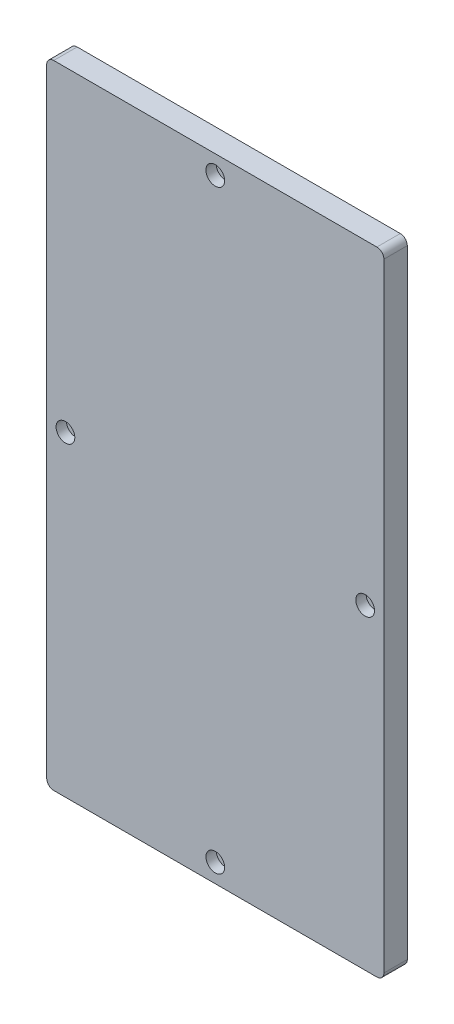
ISO-10303-21;
HEADER;
FILE_DESCRIPTION(('STEP AP214'),'2;1');
FILE_NAME('part.step','',(''),(''),'','','');
FILE_SCHEMA(('AUTOMOTIVE_DESIGN { 1 0 10303 214 1 1 1 1 }'));
ENDSEC;
DATA;
#1=APPLICATION_CONTEXT('core data for automotive mechanical design processes');
#2=APPLICATION_PROTOCOL_DEFINITION('international standard','automotive_design',2000,#1);
#3=PRODUCT_CONTEXT('',#1,'mechanical');
#4=PRODUCT('Part','Part','',(#3));
#5=PRODUCT_RELATED_PRODUCT_CATEGORY('part','',(#4));
#6=PRODUCT_DEFINITION_FORMATION('','',#4);
#7=PRODUCT_DEFINITION_CONTEXT('part definition',#1,'design');
#8=PRODUCT_DEFINITION('design','',#6,#7);
#9=PRODUCT_DEFINITION_SHAPE('','',#8);
#10=(LENGTH_UNIT() NAMED_UNIT(*) SI_UNIT(.MILLI.,.METRE.));
#11=(NAMED_UNIT(*) PLANE_ANGLE_UNIT() SI_UNIT($,.RADIAN.));
#12=(NAMED_UNIT(*) SI_UNIT($,.STERADIAN.) SOLID_ANGLE_UNIT());
#13=UNCERTAINTY_MEASURE_WITH_UNIT(LENGTH_MEASURE(1.E-05),#10,'distance_accuracy_value','');
#14=(GEOMETRIC_REPRESENTATION_CONTEXT(3) GLOBAL_UNCERTAINTY_ASSIGNED_CONTEXT((#13)) GLOBAL_UNIT_ASSIGNED_CONTEXT((#10,
#11,#12)) REPRESENTATION_CONTEXT('',''));
#15=CARTESIAN_POINT('',(0.,0.,0.));
#16=DIRECTION('',(0.,0.,1.));
#17=DIRECTION('',(1.,0.,0.));
#18=AXIS2_PLACEMENT_3D('',#15,#16,#17);
#19=CARTESIAN_POINT('',(0.,0.,0.));
#20=DIRECTION('',(0.,0.,1.));
#21=DIRECTION('',(1.,0.,0.));
#22=AXIS2_PLACEMENT_3D('',#19,#20,#21);
#23=PLANE('',#22);
#24=CARTESIAN_POINT('',(0.,127.,0.));
#25=DIRECTION('',(0.,0.,1.));
#26=DIRECTION('',(1.,0.,0.));
#27=AXIS2_PLACEMENT_3D('',#24,#25,#26);
#28=CIRCLE('',#27,2.275);
#29=CARTESIAN_POINT('',(2.275,127.,0.));
#30=VERTEX_POINT('',#29);
#31=EDGE_CURVE('E197',#30,#30,#28,.T.);
#32=ORIENTED_EDGE('',*,*,#31,.T.);
#33=EDGE_LOOP('',(#32));
#34=FACE_BOUND('',#33,.T.);
#35=CARTESIAN_POINT('',(-64.,0.,0.));
#36=DIRECTION('',(0.,0.,1.));
#37=DIRECTION('',(1.,0.,0.));
#38=AXIS2_PLACEMENT_3D('',#35,#36,#37);
#39=CIRCLE('',#38,2.275);
#40=CARTESIAN_POINT('',(-61.725,0.,0.));
#41=VERTEX_POINT('',#40);
#42=EDGE_CURVE('E266',#41,#41,#39,.T.);
#43=ORIENTED_EDGE('',*,*,#42,.T.);
#44=EDGE_LOOP('',(#43));
#45=FACE_BOUND('',#44,.T.);
#46=CARTESIAN_POINT('',(0.,-127.,0.));
#47=DIRECTION('',(0.,0.,1.));
#48=DIRECTION('',(1.,0.,0.));
#49=AXIS2_PLACEMENT_3D('',#46,#47,#48);
#50=CIRCLE('',#49,2.275);
#51=CARTESIAN_POINT('',(2.275,-127.,0.));
#52=VERTEX_POINT('',#51);
#53=EDGE_CURVE('E281',#52,#52,#50,.T.);
#54=ORIENTED_EDGE('',*,*,#53,.T.);
#55=EDGE_LOOP('',(#54));
#56=FACE_BOUND('',#55,.T.);
#57=CARTESIAN_POINT('',(64.,0.,0.));
#58=DIRECTION('',(0.,0.,1.));
#59=DIRECTION('',(1.,0.,0.));
#60=AXIS2_PLACEMENT_3D('',#57,#58,#59);
#61=CIRCLE('',#60,2.275);
#62=CARTESIAN_POINT('',(66.275,0.,0.));
#63=VERTEX_POINT('',#62);
#64=EDGE_CURVE('E296',#63,#63,#61,.T.);
#65=ORIENTED_EDGE('',*,*,#64,.T.);
#66=EDGE_LOOP('',(#65));
#67=FACE_BOUND('',#66,.T.);
#68=DIRECTION('',(0.,-1.,0.));
#69=VECTOR('',#68,1.);
#70=CARTESIAN_POINT('',(-72.,-135.,0.));
#71=LINE('',#70,#69);
#72=CARTESIAN_POINT('',(-72.,132.,0.));
#73=VERTEX_POINT('',#72);
#74=CARTESIAN_POINT('',(-72.,-132.,0.));
#75=VERTEX_POINT('',#74);
#76=EDGE_CURVE('E311',#73,#75,#71,.T.);
#77=ORIENTED_EDGE('',*,*,#76,.F.);
#78=CARTESIAN_POINT('',(-69.,132.,0.));
#79=DIRECTION('',(0.,0.,1.));
#80=DIRECTION('',(1.,0.,0.));
#81=AXIS2_PLACEMENT_3D('',#78,#79,#80);
#82=CIRCLE('',#81,3.);
#83=CARTESIAN_POINT('',(-69.,135.,0.));
#84=VERTEX_POINT('',#83);
#85=EDGE_CURVE('E343',#73,#84,#82,.F.);
#86=ORIENTED_EDGE('',*,*,#85,.T.);
#87=DIRECTION('',(-1.,0.,0.));
#88=VECTOR('',#87,1.);
#89=CARTESIAN_POINT('',(72.,135.,0.));
#90=LINE('',#89,#88);
#91=CARTESIAN_POINT('',(69.,135.,0.));
#92=VERTEX_POINT('',#91);
#93=EDGE_CURVE('E316',#92,#84,#90,.T.);
#94=ORIENTED_EDGE('',*,*,#93,.F.);
#95=CARTESIAN_POINT('',(69.,132.,0.));
#96=DIRECTION('',(0.,0.,1.));
#97=DIRECTION('',(1.,0.,0.));
#98=AXIS2_PLACEMENT_3D('',#95,#96,#97);
#99=CIRCLE('',#98,3.);
#100=CARTESIAN_POINT('',(72.,132.,0.));
#101=VERTEX_POINT('',#100);
#102=EDGE_CURVE('E337',#92,#101,#99,.F.);
#103=ORIENTED_EDGE('',*,*,#102,.T.);
#104=DIRECTION('',(0.,1.,0.));
#105=VECTOR('',#104,1.);
#106=CARTESIAN_POINT('',(72.,-135.,0.));
#107=LINE('',#106,#105);
#108=CARTESIAN_POINT('',(72.,-132.,0.));
#109=VERTEX_POINT('',#108);
#110=EDGE_CURVE('E329',#109,#101,#107,.T.);
#111=ORIENTED_EDGE('',*,*,#110,.F.);
#112=CARTESIAN_POINT('',(69.,-132.,0.));
#113=DIRECTION('',(0.,0.,1.));
#114=DIRECTION('',(1.,0.,0.));
#115=AXIS2_PLACEMENT_3D('',#112,#113,#114);
#116=CIRCLE('',#115,3.);
#117=CARTESIAN_POINT('',(69.,-135.,0.));
#118=VERTEX_POINT('',#117);
#119=EDGE_CURVE('E339',#109,#118,#116,.F.);
#120=ORIENTED_EDGE('',*,*,#119,.T.);
#121=DIRECTION('',(1.,0.,0.));
#122=VECTOR('',#121,1.);
#123=CARTESIAN_POINT('',(72.,-135.,0.));
#124=LINE('',#123,#122);
#125=CARTESIAN_POINT('',(-69.,-135.,0.));
#126=VERTEX_POINT('',#125);
#127=EDGE_CURVE('E326',#126,#118,#124,.T.);
#128=ORIENTED_EDGE('',*,*,#127,.F.);
#129=CARTESIAN_POINT('',(-69.,-132.,0.));
#130=DIRECTION('',(0.,0.,1.));
#131=DIRECTION('',(1.,0.,0.));
#132=AXIS2_PLACEMENT_3D('',#129,#130,#131);
#133=CIRCLE('',#132,3.);
#134=EDGE_CURVE('E341',#126,#75,#133,.F.);
#135=ORIENTED_EDGE('',*,*,#134,.T.);
#136=EDGE_LOOP('',(#77,#86,#94,#103,#111,#120,#128,#135));
#137=FACE_BOUND('',#136,.T.);
#138=DIRECTION('',(-1.,0.,0.));
#139=VECTOR('',#138,1.);
#140=CARTESIAN_POINT('',(0.,-130.,0.));
#141=LINE('',#140,#139);
#142=CARTESIAN_POINT('',(67.,-130.,0.));
#143=VERTEX_POINT('',#142);
#144=CARTESIAN_POINT('',(6.32455532033673,-130.,0.));
#145=VERTEX_POINT('',#144);
#146=EDGE_CURVE('E202',#143,#145,#141,.T.);
#147=ORIENTED_EDGE('',*,*,#146,.F.);
#148=DIRECTION('',(0.,-1.,0.));
#149=VECTOR('',#148,1.);
#150=CARTESIAN_POINT('',(67.,0.,0.));
#151=LINE('',#150,#149);
#152=CARTESIAN_POINT('',(67.,-6.32455532033675,0.));
#153=VERTEX_POINT('',#152);
#154=EDGE_CURVE('E181',#153,#143,#151,.T.);
#155=ORIENTED_EDGE('',*,*,#154,.F.);
#156=CARTESIAN_POINT('',(64.,0.,0.));
#157=DIRECTION('',(0.,0.,1.));
#158=DIRECTION('',(1.,0.,0.));
#159=AXIS2_PLACEMENT_3D('',#156,#157,#158);
#160=CIRCLE('',#159,7.);
#161=CARTESIAN_POINT('',(67.,6.32455532033675,0.));
#162=VERTEX_POINT('',#161);
#163=EDGE_CURVE('E193',#162,#153,#160,.T.);
#164=ORIENTED_EDGE('',*,*,#163,.F.);
#165=DIRECTION('',(0.,-1.,0.));
#166=VECTOR('',#165,1.);
#167=CARTESIAN_POINT('',(67.,0.,0.));
#168=LINE('',#167,#166);
#169=CARTESIAN_POINT('',(67.,130.,0.));
#170=VERTEX_POINT('',#169);
#171=EDGE_CURVE('E875',#170,#162,#168,.T.);
#172=ORIENTED_EDGE('',*,*,#171,.F.);
#173=DIRECTION('',(1.,0.,0.));
#174=VECTOR('',#173,1.);
#175=CARTESIAN_POINT('',(0.,130.,0.));
#176=LINE('',#175,#174);
#177=CARTESIAN_POINT('',(6.32455532033675,130.,0.));
#178=VERTEX_POINT('',#177);
#179=EDGE_CURVE('E874',#178,#170,#176,.T.);
#180=ORIENTED_EDGE('',*,*,#179,.F.);
#181=CARTESIAN_POINT('',(0.,127.,0.));
#182=DIRECTION('',(0.,0.,1.));
#183=DIRECTION('',(1.,0.,0.));
#184=AXIS2_PLACEMENT_3D('',#181,#182,#183);
#185=CIRCLE('',#184,7.00000000000001);
#186=CARTESIAN_POINT('',(-6.32455532033675,130.,0.));
#187=VERTEX_POINT('',#186);
#188=EDGE_CURVE('E877',#178,#187,#185,.F.);
#189=ORIENTED_EDGE('',*,*,#188,.T.);
#190=DIRECTION('',(1.,0.,0.));
#191=VECTOR('',#190,1.);
#192=CARTESIAN_POINT('',(0.,130.,0.));
#193=LINE('',#192,#191);
#194=CARTESIAN_POINT('',(-67.,130.,0.));
#195=VERTEX_POINT('',#194);
#196=EDGE_CURVE('E866',#195,#187,#193,.T.);
#197=ORIENTED_EDGE('',*,*,#196,.F.);
#198=DIRECTION('',(0.,1.,0.));
#199=VECTOR('',#198,1.);
#200=CARTESIAN_POINT('',(-67.,0.,0.));
#201=LINE('',#200,#199);
#202=CARTESIAN_POINT('',(-67.,6.32455532033677,0.));
#203=VERTEX_POINT('',#202);
#204=EDGE_CURVE('E863',#203,#195,#201,.T.);
#205=ORIENTED_EDGE('',*,*,#204,.F.);
#206=CARTESIAN_POINT('',(-64.,0.,0.));
#207=DIRECTION('',(0.,0.,1.));
#208=DIRECTION('',(1.,0.,0.));
#209=AXIS2_PLACEMENT_3D('',#206,#207,#208);
#210=CIRCLE('',#209,7.);
#211=CARTESIAN_POINT('',(-67.,-6.32455532033677,0.));
#212=VERTEX_POINT('',#211);
#213=EDGE_CURVE('E883',#203,#212,#210,.F.);
#214=ORIENTED_EDGE('',*,*,#213,.T.);
#215=DIRECTION('',(0.,1.,0.));
#216=VECTOR('',#215,1.);
#217=CARTESIAN_POINT('',(-67.,0.,0.));
#218=LINE('',#217,#216);
#219=CARTESIAN_POINT('',(-67.,-130.,0.));
#220=VERTEX_POINT('',#219);
#221=EDGE_CURVE('E854',#220,#212,#218,.T.);
#222=ORIENTED_EDGE('',*,*,#221,.F.);
#223=DIRECTION('',(-1.,0.,0.));
#224=VECTOR('',#223,1.);
#225=CARTESIAN_POINT('',(0.,-130.,0.));
#226=LINE('',#225,#224);
#227=CARTESIAN_POINT('',(-6.32455532033673,-130.,0.));
#228=VERTEX_POINT('',#227);
#229=EDGE_CURVE('E851',#228,#220,#226,.T.);
#230=ORIENTED_EDGE('',*,*,#229,.F.);
#231=CARTESIAN_POINT('',(0.,-127.,0.));
#232=DIRECTION('',(0.,0.,1.));
#233=DIRECTION('',(1.,0.,0.));
#234=AXIS2_PLACEMENT_3D('',#231,#232,#233);
#235=CIRCLE('',#234,7.);
#236=EDGE_CURVE('E207',#145,#228,#235,.T.);
#237=ORIENTED_EDGE('',*,*,#236,.F.);
#238=EDGE_LOOP('',(#147,#155,#164,#172,#180,#189,#197,#205,#214,#222,#230,#237));
#239=FACE_BOUND('',#238,.T.);
#240=ADVANCED_FACE('F39',(#34,#45,#56,#67,#137,#239),#23,.F.);
#241=CARTESIAN_POINT('',(-72.,-135.,10.));
#242=DIRECTION('',(1.,0.,0.));
#243=DIRECTION('',(0.,0.,-1.));
#244=AXIS2_PLACEMENT_3D('',#241,#242,#243);
#245=PLANE('',#244);
#246=DIRECTION('',(0.,-1.,0.));
#247=VECTOR('',#246,1.);
#248=CARTESIAN_POINT('',(-72.,-135.,10.));
#249=LINE('',#248,#247);
#250=CARTESIAN_POINT('',(-72.,132.,10.));
#251=VERTEX_POINT('',#250);
#252=CARTESIAN_POINT('',(-72.,-132.,10.));
#253=VERTEX_POINT('',#252);
#254=EDGE_CURVE('E312',#251,#253,#249,.T.);
#255=ORIENTED_EDGE('',*,*,#254,.F.);
#256=DIRECTION('',(0.,0.,-1.));
#257=VECTOR('',#256,1.);
#258=CARTESIAN_POINT('',(-72.,132.,10.));
#259=LINE('',#258,#257);
#260=EDGE_CURVE('E334',#251,#73,#259,.T.);
#261=ORIENTED_EDGE('',*,*,#260,.T.);
#262=ORIENTED_EDGE('',*,*,#76,.T.);
#263=DIRECTION('',(0.,0.,-1.));
#264=VECTOR('',#263,1.);
#265=CARTESIAN_POINT('',(-72.,-132.,10.));
#266=LINE('',#265,#264);
#267=EDGE_CURVE('E323',#75,#253,#266,.F.);
#268=ORIENTED_EDGE('',*,*,#267,.T.);
#269=EDGE_LOOP('',(#255,#261,#262,#268));
#270=FACE_BOUND('',#269,.T.);
#271=ADVANCED_FACE('F391',(#270),#245,.F.);
#272=CARTESIAN_POINT('',(72.,-135.,10.));
#273=DIRECTION('',(0.,1.,0.));
#274=DIRECTION('',(-1.,0.,0.));
#275=AXIS2_PLACEMENT_3D('',#272,#273,#274);
#276=PLANE('',#275);
#277=DIRECTION('',(1.,0.,0.));
#278=VECTOR('',#277,1.);
#279=CARTESIAN_POINT('',(72.,-135.,10.));
#280=LINE('',#279,#278);
#281=CARTESIAN_POINT('',(-69.,-135.,10.));
#282=VERTEX_POINT('',#281);
#283=CARTESIAN_POINT('',(69.,-135.,10.));
#284=VERTEX_POINT('',#283);
#285=EDGE_CURVE('E315',#282,#284,#280,.T.);
#286=ORIENTED_EDGE('',*,*,#285,.F.);
#287=DIRECTION('',(0.,0.,-1.));
#288=VECTOR('',#287,1.);
#289=CARTESIAN_POINT('',(-69.,-135.,10.));
#290=LINE('',#289,#288);
#291=EDGE_CURVE('E359',#282,#126,#290,.T.);
#292=ORIENTED_EDGE('',*,*,#291,.T.);
#293=ORIENTED_EDGE('',*,*,#127,.T.);
#294=DIRECTION('',(0.,0.,-1.));
#295=VECTOR('',#294,1.);
#296=CARTESIAN_POINT('',(69.,-135.,10.));
#297=LINE('',#296,#295);
#298=EDGE_CURVE('E357',#118,#284,#297,.F.);
#299=ORIENTED_EDGE('',*,*,#298,.T.);
#300=EDGE_LOOP('',(#286,#292,#293,#299));
#301=FACE_BOUND('',#300,.T.);
#302=ADVANCED_FACE('F365',(#301),#276,.F.);
#303=CARTESIAN_POINT('',(72.,-135.,10.));
#304=DIRECTION('',(-1.,0.,0.));
#305=DIRECTION('',(0.,0.,1.));
#306=AXIS2_PLACEMENT_3D('',#303,#304,#305);
#307=PLANE('',#306);
#308=DIRECTION('',(0.,1.,0.));
#309=VECTOR('',#308,1.);
#310=CARTESIAN_POINT('',(72.,-135.,10.));
#311=LINE('',#310,#309);
#312=CARTESIAN_POINT('',(72.,-132.,10.));
#313=VERTEX_POINT('',#312);
#314=CARTESIAN_POINT('',(72.,132.,10.));
#315=VERTEX_POINT('',#314);
#316=EDGE_CURVE('E318',#313,#315,#311,.T.);
#317=ORIENTED_EDGE('',*,*,#316,.F.);
#318=DIRECTION('',(0.,0.,-1.));
#319=VECTOR('',#318,1.);
#320=CARTESIAN_POINT('',(72.,-132.,10.));
#321=LINE('',#320,#319);
#322=EDGE_CURVE('E11',#313,#109,#321,.T.);
#323=ORIENTED_EDGE('',*,*,#322,.T.);
#324=ORIENTED_EDGE('',*,*,#110,.T.);
#325=DIRECTION('',(0.,0.,-1.));
#326=VECTOR('',#325,1.);
#327=CARTESIAN_POINT('',(72.,132.,10.));
#328=LINE('',#327,#326);
#329=EDGE_CURVE('E47',#101,#315,#328,.F.);
#330=ORIENTED_EDGE('',*,*,#329,.T.);
#331=EDGE_LOOP('',(#317,#323,#324,#330));
#332=FACE_BOUND('',#331,.T.);
#333=ADVANCED_FACE('F375',(#332),#307,.F.);
#334=CARTESIAN_POINT('',(72.,135.,10.));
#335=DIRECTION('',(0.,-1.,0.));
#336=DIRECTION('',(0.,0.,-1.));
#337=AXIS2_PLACEMENT_3D('',#334,#335,#336);
#338=PLANE('',#337);
#339=ORIENTED_EDGE('',*,*,#93,.T.);
#340=DIRECTION('',(0.,0.,-1.));
#341=VECTOR('',#340,1.);
#342=CARTESIAN_POINT('',(-69.,135.,10.));
#343=LINE('',#342,#341);
#344=CARTESIAN_POINT('',(-69.,135.,10.));
#345=VERTEX_POINT('',#344);
#346=EDGE_CURVE('E348',#84,#345,#343,.F.);
#347=ORIENTED_EDGE('',*,*,#346,.T.);
#348=DIRECTION('',(-1.,0.,0.));
#349=VECTOR('',#348,1.);
#350=CARTESIAN_POINT('',(72.,135.,10.));
#351=LINE('',#350,#349);
#352=CARTESIAN_POINT('',(69.,135.,10.));
#353=VERTEX_POINT('',#352);
#354=EDGE_CURVE('E320',#353,#345,#351,.T.);
#355=ORIENTED_EDGE('',*,*,#354,.F.);
#356=DIRECTION('',(0.,0.,-1.));
#357=VECTOR('',#356,1.);
#358=CARTESIAN_POINT('',(69.,135.,10.));
#359=LINE('',#358,#357);
#360=EDGE_CURVE('E345',#353,#92,#359,.T.);
#361=ORIENTED_EDGE('',*,*,#360,.T.);
#362=EDGE_LOOP('',(#339,#347,#355,#361));
#363=FACE_BOUND('',#362,.T.);
#364=ADVANCED_FACE('F383',(#363),#338,.F.);
#365=CARTESIAN_POINT('',(0.,0.,10.));
#366=DIRECTION('',(0.,0.,1.));
#367=DIRECTION('',(1.,0.,0.));
#368=AXIS2_PLACEMENT_3D('',#365,#366,#367);
#369=PLANE('',#368);
#370=CARTESIAN_POINT('',(0.,127.,10.));
#371=DIRECTION('',(0.,0.,1.));
#372=DIRECTION('',(1.,0.,0.));
#373=AXIS2_PLACEMENT_3D('',#370,#371,#372);
#374=CIRCLE('',#373,4.);
#375=CARTESIAN_POINT('',(4.,127.,10.));
#376=VERTEX_POINT('',#375);
#377=EDGE_CURVE('E254',#376,#376,#374,.T.);
#378=ORIENTED_EDGE('',*,*,#377,.F.);
#379=EDGE_LOOP('',(#378));
#380=FACE_BOUND('',#379,.T.);
#381=CARTESIAN_POINT('',(-64.,0.,10.));
#382=DIRECTION('',(0.,0.,1.));
#383=DIRECTION('',(1.,0.,0.));
#384=AXIS2_PLACEMENT_3D('',#381,#382,#383);
#385=CIRCLE('',#384,4.);
#386=CARTESIAN_POINT('',(-60.,0.,10.));
#387=VERTEX_POINT('',#386);
#388=EDGE_CURVE('E269',#387,#387,#385,.T.);
#389=ORIENTED_EDGE('',*,*,#388,.F.);
#390=EDGE_LOOP('',(#389));
#391=FACE_BOUND('',#390,.T.);
#392=CARTESIAN_POINT('',(0.,-127.,10.));
#393=DIRECTION('',(0.,0.,1.));
#394=DIRECTION('',(1.,0.,0.));
#395=AXIS2_PLACEMENT_3D('',#392,#393,#394);
#396=CIRCLE('',#395,4.);
#397=CARTESIAN_POINT('',(4.,-127.,10.));
#398=VERTEX_POINT('',#397);
#399=EDGE_CURVE('E284',#398,#398,#396,.T.);
#400=ORIENTED_EDGE('',*,*,#399,.F.);
#401=EDGE_LOOP('',(#400));
#402=FACE_BOUND('',#401,.T.);
#403=CARTESIAN_POINT('',(64.,0.,10.));
#404=DIRECTION('',(0.,0.,1.));
#405=DIRECTION('',(1.,0.,0.));
#406=AXIS2_PLACEMENT_3D('',#403,#404,#405);
#407=CIRCLE('',#406,4.);
#408=CARTESIAN_POINT('',(68.,0.,10.));
#409=VERTEX_POINT('',#408);
#410=EDGE_CURVE('E299',#409,#409,#407,.T.);
#411=ORIENTED_EDGE('',*,*,#410,.F.);
#412=EDGE_LOOP('',(#411));
#413=FACE_BOUND('',#412,.T.);
#414=ORIENTED_EDGE('',*,*,#354,.T.);
#415=CARTESIAN_POINT('',(-69.,132.,10.));
#416=DIRECTION('',(0.,0.,1.));
#417=DIRECTION('',(1.,0.,0.));
#418=AXIS2_PLACEMENT_3D('',#415,#416,#417);
#419=CIRCLE('',#418,3.);
#420=EDGE_CURVE('E355',#345,#251,#419,.T.);
#421=ORIENTED_EDGE('',*,*,#420,.T.);
#422=ORIENTED_EDGE('',*,*,#254,.T.);
#423=CARTESIAN_POINT('',(-69.,-132.,10.));
#424=DIRECTION('',(0.,0.,1.));
#425=DIRECTION('',(1.,0.,0.));
#426=AXIS2_PLACEMENT_3D('',#423,#424,#425);
#427=CIRCLE('',#426,3.);
#428=EDGE_CURVE('E353',#253,#282,#427,.T.);
#429=ORIENTED_EDGE('',*,*,#428,.T.);
#430=ORIENTED_EDGE('',*,*,#285,.T.);
#431=CARTESIAN_POINT('',(69.,-132.,10.));
#432=DIRECTION('',(0.,0.,1.));
#433=DIRECTION('',(1.,0.,0.));
#434=AXIS2_PLACEMENT_3D('',#431,#432,#433);
#435=CIRCLE('',#434,3.);
#436=EDGE_CURVE('E60',#284,#313,#435,.T.);
#437=ORIENTED_EDGE('',*,*,#436,.T.);
#438=ORIENTED_EDGE('',*,*,#316,.T.);
#439=CARTESIAN_POINT('',(69.,132.,10.));
#440=DIRECTION('',(0.,0.,1.));
#441=DIRECTION('',(1.,0.,0.));
#442=AXIS2_PLACEMENT_3D('',#439,#440,#441);
#443=CIRCLE('',#442,3.);
#444=EDGE_CURVE('E350',#315,#353,#443,.T.);
#445=ORIENTED_EDGE('',*,*,#444,.T.);
#446=EDGE_LOOP('',(#414,#421,#422,#429,#430,#437,#438,#445));
#447=FACE_BOUND('',#446,.T.);
#448=ADVANCED_FACE('F377',(#380,#391,#402,#413,#447),#369,.T.);
#449=CARTESIAN_POINT('',(64.,0.,0.024999999999999));
#450=DIRECTION('',(0.,0.,-1.));
#451=DIRECTION('',(-1.,0.,0.));
#452=AXIS2_PLACEMENT_3D('',#449,#450,#451);
#453=CONICAL_SURFACE('',#452,2.25,0.785398163397448);
#454=ORIENTED_EDGE('',*,*,#64,.F.);
#455=EDGE_LOOP('',(#454));
#456=FACE_BOUND('',#455,.T.);
#457=CARTESIAN_POINT('',(64.,0.,0.024999999999999));
#458=DIRECTION('',(0.,0.,1.));
#459=DIRECTION('',(1.,0.,0.));
#460=AXIS2_PLACEMENT_3D('',#457,#458,#459);
#461=CIRCLE('',#460,2.25);
#462=CARTESIAN_POINT('',(66.25,0.,0.024999999999999));
#463=VERTEX_POINT('',#462);
#464=EDGE_CURVE('E308',#463,#463,#461,.T.);
#465=ORIENTED_EDGE('',*,*,#464,.T.);
#466=EDGE_LOOP('',(#465));
#467=FACE_BOUND('',#466,.T.);
#468=ADVANCED_FACE('F436',(#456,#467),#453,.F.);
#469=CARTESIAN_POINT('',(64.,0.,10.));
#470=DIRECTION('',(0.,0.,1.));
#471=DIRECTION('',(1.,0.,0.));
#472=AXIS2_PLACEMENT_3D('',#469,#470,#471);
#473=CYLINDRICAL_SURFACE('',#472,2.25);
#474=ORIENTED_EDGE('',*,*,#464,.F.);
#475=EDGE_LOOP('',(#474));
#476=FACE_BOUND('',#475,.T.);
#477=CARTESIAN_POINT('',(64.,0.,5.6));
#478=DIRECTION('',(0.,0.,1.));
#479=DIRECTION('',(1.,0.,0.));
#480=AXIS2_PLACEMENT_3D('',#477,#478,#479);
#481=CIRCLE('',#480,2.25);
#482=CARTESIAN_POINT('',(66.25,0.,5.6));
#483=VERTEX_POINT('',#482);
#484=EDGE_CURVE('E305',#483,#483,#481,.T.);
#485=ORIENTED_EDGE('',*,*,#484,.T.);
#486=EDGE_LOOP('',(#485));
#487=FACE_BOUND('',#486,.T.);
#488=ADVANCED_FACE('F444',(#476,#487),#473,.F.);
#489=CARTESIAN_POINT('',(66.25,0.,5.6));
#490=DIRECTION('',(0.,0.,-1.));
#491=DIRECTION('',(-1.,0.,0.));
#492=AXIS2_PLACEMENT_3D('',#489,#490,#491);
#493=PLANE('',#492);
#494=ORIENTED_EDGE('',*,*,#484,.F.);
#495=EDGE_LOOP('',(#494));
#496=FACE_BOUND('',#495,.T.);
#497=CARTESIAN_POINT('',(64.,0.,5.6));
#498=DIRECTION('',(0.,0.,1.));
#499=DIRECTION('',(1.,0.,0.));
#500=AXIS2_PLACEMENT_3D('',#497,#498,#499);
#501=CIRCLE('',#500,4.);
#502=CARTESIAN_POINT('',(68.,0.,5.6));
#503=VERTEX_POINT('',#502);
#504=EDGE_CURVE('E302',#503,#503,#501,.T.);
#505=ORIENTED_EDGE('',*,*,#504,.T.);
#506=EDGE_LOOP('',(#505));
#507=FACE_BOUND('',#506,.T.);
#508=ADVANCED_FACE('F451',(#496,#507),#493,.F.);
#509=CARTESIAN_POINT('',(64.,0.,10.));
#510=DIRECTION('',(0.,0.,1.));
#511=DIRECTION('',(1.,0.,0.));
#512=AXIS2_PLACEMENT_3D('',#509,#510,#511);
#513=CYLINDRICAL_SURFACE('',#512,4.);
#514=ORIENTED_EDGE('',*,*,#504,.F.);
#515=EDGE_LOOP('',(#514));
#516=FACE_BOUND('',#515,.T.);
#517=ORIENTED_EDGE('',*,*,#410,.T.);
#518=EDGE_LOOP('',(#517));
#519=FACE_BOUND('',#518,.T.);
#520=ADVANCED_FACE('F459',(#516,#519),#513,.F.);
#521=CARTESIAN_POINT('',(0.,-127.,0.024999999999999));
#522=DIRECTION('',(0.,0.,-1.));
#523=DIRECTION('',(-1.,0.,0.));
#524=AXIS2_PLACEMENT_3D('',#521,#522,#523);
#525=CONICAL_SURFACE('',#524,2.25,0.785398163397466);
#526=ORIENTED_EDGE('',*,*,#53,.F.);
#527=EDGE_LOOP('',(#526));
#528=FACE_BOUND('',#527,.T.);
#529=CARTESIAN_POINT('',(0.,-127.,0.024999999999999));
#530=DIRECTION('',(0.,0.,1.));
#531=DIRECTION('',(1.,0.,0.));
#532=AXIS2_PLACEMENT_3D('',#529,#530,#531);
#533=CIRCLE('',#532,2.25);
#534=CARTESIAN_POINT('',(2.25,-127.,0.024999999999999));
#535=VERTEX_POINT('',#534);
#536=EDGE_CURVE('E293',#535,#535,#533,.T.);
#537=ORIENTED_EDGE('',*,*,#536,.T.);
#538=EDGE_LOOP('',(#537));
#539=FACE_BOUND('',#538,.T.);
#540=ADVANCED_FACE('F467',(#528,#539),#525,.F.);
#541=CARTESIAN_POINT('',(0.,-127.,10.));
#542=DIRECTION('',(0.,0.,1.));
#543=DIRECTION('',(1.,0.,0.));
#544=AXIS2_PLACEMENT_3D('',#541,#542,#543);
#545=CYLINDRICAL_SURFACE('',#544,2.25);
#546=ORIENTED_EDGE('',*,*,#536,.F.);
#547=EDGE_LOOP('',(#546));
#548=FACE_BOUND('',#547,.T.);
#549=CARTESIAN_POINT('',(0.,-127.,5.6));
#550=DIRECTION('',(0.,0.,1.));
#551=DIRECTION('',(1.,0.,0.));
#552=AXIS2_PLACEMENT_3D('',#549,#550,#551);
#553=CIRCLE('',#552,2.25);
#554=CARTESIAN_POINT('',(2.25,-127.,5.6));
#555=VERTEX_POINT('',#554);
#556=EDGE_CURVE('E290',#555,#555,#553,.T.);
#557=ORIENTED_EDGE('',*,*,#556,.T.);
#558=EDGE_LOOP('',(#557));
#559=FACE_BOUND('',#558,.T.);
#560=ADVANCED_FACE('F475',(#548,#559),#545,.F.);
#561=CARTESIAN_POINT('',(2.25,-127.,5.6));
#562=DIRECTION('',(0.,0.,-1.));
#563=DIRECTION('',(-1.,0.,0.));
#564=AXIS2_PLACEMENT_3D('',#561,#562,#563);
#565=PLANE('',#564);
#566=ORIENTED_EDGE('',*,*,#556,.F.);
#567=EDGE_LOOP('',(#566));
#568=FACE_BOUND('',#567,.T.);
#569=CARTESIAN_POINT('',(0.,-127.,5.6));
#570=DIRECTION('',(0.,0.,1.));
#571=DIRECTION('',(1.,0.,0.));
#572=AXIS2_PLACEMENT_3D('',#569,#570,#571);
#573=CIRCLE('',#572,4.);
#574=CARTESIAN_POINT('',(4.,-127.,5.6));
#575=VERTEX_POINT('',#574);
#576=EDGE_CURVE('E287',#575,#575,#573,.T.);
#577=ORIENTED_EDGE('',*,*,#576,.T.);
#578=EDGE_LOOP('',(#577));
#579=FACE_BOUND('',#578,.T.);
#580=ADVANCED_FACE('F483',(#568,#579),#565,.F.);
#581=CARTESIAN_POINT('',(0.,-127.,10.));
#582=DIRECTION('',(0.,0.,1.));
#583=DIRECTION('',(1.,0.,0.));
#584=AXIS2_PLACEMENT_3D('',#581,#582,#583);
#585=CYLINDRICAL_SURFACE('',#584,4.);
#586=ORIENTED_EDGE('',*,*,#576,.F.);
#587=EDGE_LOOP('',(#586));
#588=FACE_BOUND('',#587,.T.);
#589=ORIENTED_EDGE('',*,*,#399,.T.);
#590=EDGE_LOOP('',(#589));
#591=FACE_BOUND('',#590,.T.);
#592=ADVANCED_FACE('F491',(#588,#591),#585,.F.);
#593=CARTESIAN_POINT('',(-64.,0.,0.024999999999999));
#594=DIRECTION('',(0.,0.,-1.));
#595=DIRECTION('',(-1.,0.,0.));
#596=AXIS2_PLACEMENT_3D('',#593,#594,#595);
#597=CONICAL_SURFACE('',#596,2.25,0.785398163397448);
#598=ORIENTED_EDGE('',*,*,#42,.F.);
#599=EDGE_LOOP('',(#598));
#600=FACE_BOUND('',#599,.T.);
#601=CARTESIAN_POINT('',(-64.,0.,0.024999999999999));
#602=DIRECTION('',(0.,0.,1.));
#603=DIRECTION('',(1.,0.,0.));
#604=AXIS2_PLACEMENT_3D('',#601,#602,#603);
#605=CIRCLE('',#604,2.25);
#606=CARTESIAN_POINT('',(-61.75,0.,0.024999999999999));
#607=VERTEX_POINT('',#606);
#608=EDGE_CURVE('E278',#607,#607,#605,.T.);
#609=ORIENTED_EDGE('',*,*,#608,.T.);
#610=EDGE_LOOP('',(#609));
#611=FACE_BOUND('',#610,.T.);
#612=ADVANCED_FACE('F500',(#600,#611),#597,.F.);
#613=CARTESIAN_POINT('',(-64.,0.,10.));
#614=DIRECTION('',(0.,0.,1.));
#615=DIRECTION('',(1.,0.,0.));
#616=AXIS2_PLACEMENT_3D('',#613,#614,#615);
#617=CYLINDRICAL_SURFACE('',#616,2.25);
#618=ORIENTED_EDGE('',*,*,#608,.F.);
#619=EDGE_LOOP('',(#618));
#620=FACE_BOUND('',#619,.T.);
#621=CARTESIAN_POINT('',(-64.,0.,5.6));
#622=DIRECTION('',(0.,0.,1.));
#623=DIRECTION('',(1.,0.,0.));
#624=AXIS2_PLACEMENT_3D('',#621,#622,#623);
#625=CIRCLE('',#624,2.25);
#626=CARTESIAN_POINT('',(-61.75,0.,5.6));
#627=VERTEX_POINT('',#626);
#628=EDGE_CURVE('E275',#627,#627,#625,.T.);
#629=ORIENTED_EDGE('',*,*,#628,.T.);
#630=EDGE_LOOP('',(#629));
#631=FACE_BOUND('',#630,.T.);
#632=ADVANCED_FACE('F508',(#620,#631),#617,.F.);
#633=CARTESIAN_POINT('',(-61.75,0.,5.6));
#634=DIRECTION('',(0.,0.,-1.));
#635=DIRECTION('',(-1.,0.,0.));
#636=AXIS2_PLACEMENT_3D('',#633,#634,#635);
#637=PLANE('',#636);
#638=ORIENTED_EDGE('',*,*,#628,.F.);
#639=EDGE_LOOP('',(#638));
#640=FACE_BOUND('',#639,.T.);
#641=CARTESIAN_POINT('',(-64.,0.,5.6));
#642=DIRECTION('',(0.,0.,1.));
#643=DIRECTION('',(1.,0.,0.));
#644=AXIS2_PLACEMENT_3D('',#641,#642,#643);
#645=CIRCLE('',#644,4.);
#646=CARTESIAN_POINT('',(-60.,0.,5.6));
#647=VERTEX_POINT('',#646);
#648=EDGE_CURVE('E272',#647,#647,#645,.T.);
#649=ORIENTED_EDGE('',*,*,#648,.T.);
#650=EDGE_LOOP('',(#649));
#651=FACE_BOUND('',#650,.T.);
#652=ADVANCED_FACE('F516',(#640,#651),#637,.F.);
#653=CARTESIAN_POINT('',(-64.,0.,10.));
#654=DIRECTION('',(0.,0.,1.));
#655=DIRECTION('',(1.,0.,0.));
#656=AXIS2_PLACEMENT_3D('',#653,#654,#655);
#657=CYLINDRICAL_SURFACE('',#656,4.);
#658=ORIENTED_EDGE('',*,*,#648,.F.);
#659=EDGE_LOOP('',(#658));
#660=FACE_BOUND('',#659,.T.);
#661=ORIENTED_EDGE('',*,*,#388,.T.);
#662=EDGE_LOOP('',(#661));
#663=FACE_BOUND('',#662,.T.);
#664=ADVANCED_FACE('F524',(#660,#663),#657,.F.);
#665=CARTESIAN_POINT('',(0.,127.,0.024999999999999));
#666=DIRECTION('',(0.,0.,-1.));
#667=DIRECTION('',(-1.,0.,0.));
#668=AXIS2_PLACEMENT_3D('',#665,#666,#667);
#669=CONICAL_SURFACE('',#668,2.25,0.785398163397466);
#670=ORIENTED_EDGE('',*,*,#31,.F.);
#671=EDGE_LOOP('',(#670));
#672=FACE_BOUND('',#671,.T.);
#673=CARTESIAN_POINT('',(0.,127.,0.024999999999999));
#674=DIRECTION('',(0.,0.,1.));
#675=DIRECTION('',(1.,0.,0.));
#676=AXIS2_PLACEMENT_3D('',#673,#674,#675);
#677=CIRCLE('',#676,2.25);
#678=CARTESIAN_POINT('',(2.25,127.,0.024999999999999));
#679=VERTEX_POINT('',#678);
#680=EDGE_CURVE('E263',#679,#679,#677,.T.);
#681=ORIENTED_EDGE('',*,*,#680,.T.);
#682=EDGE_LOOP('',(#681));
#683=FACE_BOUND('',#682,.T.);
#684=ADVANCED_FACE('F532',(#672,#683),#669,.F.);
#685=CARTESIAN_POINT('',(0.,127.,10.));
#686=DIRECTION('',(0.,0.,1.));
#687=DIRECTION('',(1.,0.,0.));
#688=AXIS2_PLACEMENT_3D('',#685,#686,#687);
#689=CYLINDRICAL_SURFACE('',#688,2.25);
#690=ORIENTED_EDGE('',*,*,#680,.F.);
#691=EDGE_LOOP('',(#690));
#692=FACE_BOUND('',#691,.T.);
#693=CARTESIAN_POINT('',(0.,127.,5.6));
#694=DIRECTION('',(0.,0.,1.));
#695=DIRECTION('',(1.,0.,0.));
#696=AXIS2_PLACEMENT_3D('',#693,#694,#695);
#697=CIRCLE('',#696,2.25);
#698=CARTESIAN_POINT('',(2.25,127.,5.6));
#699=VERTEX_POINT('',#698);
#700=EDGE_CURVE('E260',#699,#699,#697,.T.);
#701=ORIENTED_EDGE('',*,*,#700,.T.);
#702=EDGE_LOOP('',(#701));
#703=FACE_BOUND('',#702,.T.);
#704=ADVANCED_FACE('F540',(#692,#703),#689,.F.);
#705=CARTESIAN_POINT('',(2.25,127.,5.6));
#706=DIRECTION('',(0.,0.,-1.));
#707=DIRECTION('',(-1.,0.,0.));
#708=AXIS2_PLACEMENT_3D('',#705,#706,#707);
#709=PLANE('',#708);
#710=ORIENTED_EDGE('',*,*,#700,.F.);
#711=EDGE_LOOP('',(#710));
#712=FACE_BOUND('',#711,.T.);
#713=CARTESIAN_POINT('',(0.,127.,5.6));
#714=DIRECTION('',(0.,0.,1.));
#715=DIRECTION('',(1.,0.,0.));
#716=AXIS2_PLACEMENT_3D('',#713,#714,#715);
#717=CIRCLE('',#716,4.);
#718=CARTESIAN_POINT('',(4.,127.,5.6));
#719=VERTEX_POINT('',#718);
#720=EDGE_CURVE('E257',#719,#719,#717,.T.);
#721=ORIENTED_EDGE('',*,*,#720,.T.);
#722=EDGE_LOOP('',(#721));
#723=FACE_BOUND('',#722,.T.);
#724=ADVANCED_FACE('F548',(#712,#723),#709,.F.);
#725=CARTESIAN_POINT('',(0.,127.,10.));
#726=DIRECTION('',(0.,0.,1.));
#727=DIRECTION('',(1.,0.,0.));
#728=AXIS2_PLACEMENT_3D('',#725,#726,#727);
#729=CYLINDRICAL_SURFACE('',#728,4.);
#730=ORIENTED_EDGE('',*,*,#720,.F.);
#731=EDGE_LOOP('',(#730));
#732=FACE_BOUND('',#731,.T.);
#733=ORIENTED_EDGE('',*,*,#377,.T.);
#734=EDGE_LOOP('',(#733));
#735=FACE_BOUND('',#734,.T.);
#736=ADVANCED_FACE('F556',(#732,#735),#729,.F.);
#737=CARTESIAN_POINT('',(67.,0.,-0.00100000000000013));
#738=DIRECTION('',(1.,0.,0.));
#739=DIRECTION('',(0.,0.,-1.));
#740=AXIS2_PLACEMENT_3D('',#737,#738,#739);
#741=PLANE('',#740);
#742=ORIENTED_EDGE('',*,*,#154,.T.);
#743=DIRECTION('',(0.,0.,1.));
#744=VECTOR('',#743,1.);
#745=CARTESIAN_POINT('',(67.,-130.,-0.00100000000000013));
#746=LINE('',#745,#744);
#747=CARTESIAN_POINT('',(67.,-130.,5.));
#748=VERTEX_POINT('',#747);
#749=EDGE_CURVE('E198',#143,#748,#746,.T.);
#750=ORIENTED_EDGE('',*,*,#749,.T.);
#751=DIRECTION('',(0.,1.,0.));
#752=VECTOR('',#751,1.);
#753=CARTESIAN_POINT('',(67.,0.,5.));
#754=LINE('',#753,#752);
#755=CARTESIAN_POINT('',(67.,-6.32455532033675,5.));
#756=VERTEX_POINT('',#755);
#757=EDGE_CURVE('E184',#748,#756,#754,.T.);
#758=ORIENTED_EDGE('',*,*,#757,.T.);
#759=DIRECTION('',(0.,0.,1.));
#760=VECTOR('',#759,1.);
#761=CARTESIAN_POINT('',(67.,-6.32455532033675,-0.00100000000000013));
#762=LINE('',#761,#760);
#763=EDGE_CURVE('E177',#153,#756,#762,.T.);
#764=ORIENTED_EDGE('',*,*,#763,.F.);
#765=EDGE_LOOP('',(#742,#750,#758,#764));
#766=FACE_BOUND('',#765,.T.);
#767=ADVANCED_FACE('F179',(#766),#741,.F.);
#768=CARTESIAN_POINT('',(0.,-130.,-0.00100000000000013));
#769=DIRECTION('',(0.,-1.,0.));
#770=DIRECTION('',(1.,0.,0.));
#771=AXIS2_PLACEMENT_3D('',#768,#769,#770);
#772=PLANE('',#771);
#773=ORIENTED_EDGE('',*,*,#146,.T.);
#774=DIRECTION('',(0.,0.,1.));
#775=VECTOR('',#774,1.);
#776=CARTESIAN_POINT('',(6.32455532033673,-130.,-0.00100000000000013));
#777=LINE('',#776,#775);
#778=CARTESIAN_POINT('',(6.32455532033673,-130.,5.));
#779=VERTEX_POINT('',#778);
#780=EDGE_CURVE('E233',#145,#779,#777,.T.);
#781=ORIENTED_EDGE('',*,*,#780,.T.);
#782=DIRECTION('',(1.,0.,0.));
#783=VECTOR('',#782,1.);
#784=CARTESIAN_POINT('',(0.,-130.,5.));
#785=LINE('',#784,#783);
#786=EDGE_CURVE('E189',#779,#748,#785,.T.);
#787=ORIENTED_EDGE('',*,*,#786,.T.);
#788=ORIENTED_EDGE('',*,*,#749,.F.);
#789=EDGE_LOOP('',(#773,#781,#787,#788));
#790=FACE_BOUND('',#789,.T.);
#791=ADVANCED_FACE('F570',(#790),#772,.F.);
#792=CARTESIAN_POINT('',(0.,-127.,-0.00100000000000013));
#793=DIRECTION('',(0.,0.,1.));
#794=DIRECTION('',(1.,0.,0.));
#795=AXIS2_PLACEMENT_3D('',#792,#793,#794);
#796=CYLINDRICAL_SURFACE('',#795,7.);
#797=ORIENTED_EDGE('',*,*,#236,.T.);
#798=DIRECTION('',(0.,0.,1.));
#799=VECTOR('',#798,1.);
#800=CARTESIAN_POINT('',(-6.32455532033673,-130.,-0.00100000000000013));
#801=LINE('',#800,#799);
#802=CARTESIAN_POINT('',(-6.32455532033673,-130.,5.));
#803=VERTEX_POINT('',#802);
#804=EDGE_CURVE('E235',#228,#803,#801,.T.);
#805=ORIENTED_EDGE('',*,*,#804,.T.);
#806=CARTESIAN_POINT('',(0.,-127.,5.));
#807=DIRECTION('',(0.,0.,1.));
#808=DIRECTION('',(1.,0.,0.));
#809=AXIS2_PLACEMENT_3D('',#806,#807,#808);
#810=CIRCLE('',#809,7.);
#811=EDGE_CURVE('E229',#803,#779,#810,.F.);
#812=ORIENTED_EDGE('',*,*,#811,.T.);
#813=ORIENTED_EDGE('',*,*,#780,.F.);
#814=EDGE_LOOP('',(#797,#805,#812,#813));
#815=FACE_BOUND('',#814,.T.);
#816=ADVANCED_FACE('F578',(#815),#796,.T.);
#817=ORIENTED_EDGE('',*,*,#229,.T.);
#818=DIRECTION('',(0.,0.,1.));
#819=VECTOR('',#818,1.);
#820=CARTESIAN_POINT('',(-67.,-130.,-0.00100000000000013));
#821=LINE('',#820,#819);
#822=CARTESIAN_POINT('',(-67.,-130.,5.));
#823=VERTEX_POINT('',#822);
#824=EDGE_CURVE('E237',#220,#823,#821,.T.);
#825=ORIENTED_EDGE('',*,*,#824,.T.);
#826=EDGE_CURVE('E226',#823,#803,#785,.T.);
#827=ORIENTED_EDGE('',*,*,#826,.T.);
#828=ORIENTED_EDGE('',*,*,#804,.F.);
#829=EDGE_LOOP('',(#817,#825,#827,#828));
#830=FACE_BOUND('',#829,.T.);
#831=ADVANCED_FACE('F581',(#830),#772,.F.);
#832=CARTESIAN_POINT('',(-67.,0.,-0.00100000000000013));
#833=DIRECTION('',(-1.,0.,0.));
#834=DIRECTION('',(0.,0.,1.));
#835=AXIS2_PLACEMENT_3D('',#832,#833,#834);
#836=PLANE('',#835);
#837=ORIENTED_EDGE('',*,*,#221,.T.);
#838=DIRECTION('',(0.,0.,1.));
#839=VECTOR('',#838,1.);
#840=CARTESIAN_POINT('',(-67.,-6.32455532033677,-0.00100000000000013));
#841=LINE('',#840,#839);
#842=CARTESIAN_POINT('',(-67.,-6.32455532033677,5.));
#843=VERTEX_POINT('',#842);
#844=EDGE_CURVE('E239',#212,#843,#841,.T.);
#845=ORIENTED_EDGE('',*,*,#844,.T.);
#846=DIRECTION('',(0.,-1.,0.));
#847=VECTOR('',#846,1.);
#848=CARTESIAN_POINT('',(-67.,0.,5.));
#849=LINE('',#848,#847);
#850=EDGE_CURVE('E223',#843,#823,#849,.T.);
#851=ORIENTED_EDGE('',*,*,#850,.T.);
#852=ORIENTED_EDGE('',*,*,#824,.F.);
#853=EDGE_LOOP('',(#837,#845,#851,#852));
#854=FACE_BOUND('',#853,.T.);
#855=ADVANCED_FACE('F594',(#854),#836,.F.);
#856=CARTESIAN_POINT('',(-64.,0.,-0.00100000000000013));
#857=DIRECTION('',(0.,0.,1.));
#858=DIRECTION('',(1.,0.,0.));
#859=AXIS2_PLACEMENT_3D('',#856,#857,#858);
#860=CYLINDRICAL_SURFACE('',#859,7.);
#861=DIRECTION('',(0.,0.,1.));
#862=VECTOR('',#861,1.);
#863=CARTESIAN_POINT('',(-67.,6.32455532033677,-0.00100000000000013));
#864=LINE('',#863,#862);
#865=CARTESIAN_POINT('',(-67.,6.32455532033677,5.));
#866=VERTEX_POINT('',#865);
#867=EDGE_CURVE('E241',#203,#866,#864,.T.);
#868=ORIENTED_EDGE('',*,*,#867,.T.);
#869=CARTESIAN_POINT('',(-64.,0.,5.));
#870=DIRECTION('',(0.,0.,1.));
#871=DIRECTION('',(1.,0.,0.));
#872=AXIS2_PLACEMENT_3D('',#869,#870,#871);
#873=CIRCLE('',#872,7.);
#874=EDGE_CURVE('E222',#843,#866,#873,.T.);
#875=ORIENTED_EDGE('',*,*,#874,.F.);
#876=ORIENTED_EDGE('',*,*,#844,.F.);
#877=ORIENTED_EDGE('',*,*,#213,.F.);
#878=EDGE_LOOP('',(#868,#875,#876,#877));
#879=FACE_BOUND('',#878,.T.);
#880=ADVANCED_FACE('F601',(#879),#860,.T.);
#881=ORIENTED_EDGE('',*,*,#204,.T.);
#882=DIRECTION('',(0.,0.,1.));
#883=VECTOR('',#882,1.);
#884=CARTESIAN_POINT('',(-67.,130.,-0.00100000000000013));
#885=LINE('',#884,#883);
#886=CARTESIAN_POINT('',(-67.,130.,5.));
#887=VERTEX_POINT('',#886);
#888=EDGE_CURVE('E243',#195,#887,#885,.T.);
#889=ORIENTED_EDGE('',*,*,#888,.T.);
#890=EDGE_CURVE('E219',#887,#866,#849,.T.);
#891=ORIENTED_EDGE('',*,*,#890,.T.);
#892=ORIENTED_EDGE('',*,*,#867,.F.);
#893=EDGE_LOOP('',(#881,#889,#891,#892));
#894=FACE_BOUND('',#893,.T.);
#895=ADVANCED_FACE('F604',(#894),#836,.F.);
#896=CARTESIAN_POINT('',(0.,130.,-0.00100000000000013));
#897=DIRECTION('',(0.,1.,0.));
#898=DIRECTION('',(0.,0.,1.));
#899=AXIS2_PLACEMENT_3D('',#896,#897,#898);
#900=PLANE('',#899);
#901=ORIENTED_EDGE('',*,*,#196,.T.);
#902=DIRECTION('',(0.,0.,1.));
#903=VECTOR('',#902,1.);
#904=CARTESIAN_POINT('',(-6.32455532033675,130.,-0.00100000000000013));
#905=LINE('',#904,#903);
#906=CARTESIAN_POINT('',(-6.32455532033675,130.,5.));
#907=VERTEX_POINT('',#906);
#908=EDGE_CURVE('E245',#187,#907,#905,.T.);
#909=ORIENTED_EDGE('',*,*,#908,.T.);
#910=DIRECTION('',(-1.,0.,0.));
#911=VECTOR('',#910,1.);
#912=CARTESIAN_POINT('',(0.,130.,5.));
#913=LINE('',#912,#911);
#914=EDGE_CURVE('E216',#907,#887,#913,.T.);
#915=ORIENTED_EDGE('',*,*,#914,.T.);
#916=ORIENTED_EDGE('',*,*,#888,.F.);
#917=EDGE_LOOP('',(#901,#909,#915,#916));
#918=FACE_BOUND('',#917,.T.);
#919=ADVANCED_FACE('F617',(#918),#900,.F.);
#920=CARTESIAN_POINT('',(0.,127.,-0.00100000000000013));
#921=DIRECTION('',(0.,0.,1.));
#922=DIRECTION('',(1.,0.,0.));
#923=AXIS2_PLACEMENT_3D('',#920,#921,#922);
#924=CYLINDRICAL_SURFACE('',#923,7.00000000000001);
#925=DIRECTION('',(0.,0.,1.));
#926=VECTOR('',#925,1.);
#927=CARTESIAN_POINT('',(6.32455532033675,130.,-0.00100000000000013));
#928=LINE('',#927,#926);
#929=CARTESIAN_POINT('',(6.32455532033675,130.,5.));
#930=VERTEX_POINT('',#929);
#931=EDGE_CURVE('E247',#178,#930,#928,.T.);
#932=ORIENTED_EDGE('',*,*,#931,.T.);
#933=CARTESIAN_POINT('',(0.,127.,5.));
#934=DIRECTION('',(0.,0.,1.));
#935=DIRECTION('',(1.,0.,0.));
#936=AXIS2_PLACEMENT_3D('',#933,#934,#935);
#937=CIRCLE('',#936,7.00000000000001);
#938=EDGE_CURVE('E215',#907,#930,#937,.T.);
#939=ORIENTED_EDGE('',*,*,#938,.F.);
#940=ORIENTED_EDGE('',*,*,#908,.F.);
#941=ORIENTED_EDGE('',*,*,#188,.F.);
#942=EDGE_LOOP('',(#932,#939,#940,#941));
#943=FACE_BOUND('',#942,.T.);
#944=ADVANCED_FACE('F624',(#943),#924,.T.);
#945=ORIENTED_EDGE('',*,*,#179,.T.);
#946=DIRECTION('',(0.,0.,1.));
#947=VECTOR('',#946,1.);
#948=CARTESIAN_POINT('',(67.,130.,-0.00100000000000013));
#949=LINE('',#948,#947);
#950=CARTESIAN_POINT('',(67.,130.,5.));
#951=VERTEX_POINT('',#950);
#952=EDGE_CURVE('E249',#170,#951,#949,.T.);
#953=ORIENTED_EDGE('',*,*,#952,.T.);
#954=EDGE_CURVE('E212',#951,#930,#913,.T.);
#955=ORIENTED_EDGE('',*,*,#954,.T.);
#956=ORIENTED_EDGE('',*,*,#931,.F.);
#957=EDGE_LOOP('',(#945,#953,#955,#956));
#958=FACE_BOUND('',#957,.T.);
#959=ADVANCED_FACE('F627',(#958),#900,.F.);
#960=ORIENTED_EDGE('',*,*,#171,.T.);
#961=DIRECTION('',(0.,0.,1.));
#962=VECTOR('',#961,1.);
#963=CARTESIAN_POINT('',(67.,6.32455532033675,-0.00100000000000013));
#964=LINE('',#963,#962);
#965=CARTESIAN_POINT('',(67.,6.32455532033675,5.));
#966=VERTEX_POINT('',#965);
#967=EDGE_CURVE('E188',#162,#966,#964,.T.);
#968=ORIENTED_EDGE('',*,*,#967,.T.);
#969=EDGE_CURVE('E206',#966,#951,#754,.T.);
#970=ORIENTED_EDGE('',*,*,#969,.T.);
#971=ORIENTED_EDGE('',*,*,#952,.F.);
#972=EDGE_LOOP('',(#960,#968,#970,#971));
#973=FACE_BOUND('',#972,.T.);
#974=ADVANCED_FACE('F572',(#973),#741,.F.);
#975=CARTESIAN_POINT('',(64.,0.,-0.00100000000000013));
#976=DIRECTION('',(0.,0.,1.));
#977=DIRECTION('',(1.,0.,0.));
#978=AXIS2_PLACEMENT_3D('',#975,#976,#977);
#979=CYLINDRICAL_SURFACE('',#978,7.);
#980=ORIENTED_EDGE('',*,*,#163,.T.);
#981=ORIENTED_EDGE('',*,*,#763,.T.);
#982=CARTESIAN_POINT('',(64.,0.,5.));
#983=DIRECTION('',(0.,0.,1.));
#984=DIRECTION('',(1.,0.,0.));
#985=AXIS2_PLACEMENT_3D('',#982,#983,#984);
#986=CIRCLE('',#985,7.);
#987=EDGE_CURVE('E204',#756,#966,#986,.F.);
#988=ORIENTED_EDGE('',*,*,#987,.T.);
#989=ORIENTED_EDGE('',*,*,#967,.F.);
#990=EDGE_LOOP('',(#980,#981,#988,#989));
#991=FACE_BOUND('',#990,.T.);
#992=ADVANCED_FACE('F194',(#991),#979,.T.);
#993=CARTESIAN_POINT('',(0.,0.,5.));
#994=DIRECTION('',(0.,0.,1.));
#995=DIRECTION('',(1.,0.,0.));
#996=AXIS2_PLACEMENT_3D('',#993,#994,#995);
#997=PLANE('',#996);
#998=ORIENTED_EDGE('',*,*,#757,.F.);
#999=ORIENTED_EDGE('',*,*,#786,.F.);
#1000=ORIENTED_EDGE('',*,*,#811,.F.);
#1001=ORIENTED_EDGE('',*,*,#826,.F.);
#1002=ORIENTED_EDGE('',*,*,#850,.F.);
#1003=ORIENTED_EDGE('',*,*,#874,.T.);
#1004=ORIENTED_EDGE('',*,*,#890,.F.);
#1005=ORIENTED_EDGE('',*,*,#914,.F.);
#1006=ORIENTED_EDGE('',*,*,#938,.T.);
#1007=ORIENTED_EDGE('',*,*,#954,.F.);
#1008=ORIENTED_EDGE('',*,*,#969,.F.);
#1009=ORIENTED_EDGE('',*,*,#987,.F.);
#1010=EDGE_LOOP('',(#998,#999,#1000,#1001,#1002,#1003,#1004,#1005,#1006,#1007,#1008,#1009));
#1011=FACE_BOUND('',#1010,.T.);
#1012=ADVANCED_FACE('F400',(#1011),#997,.F.);
#1013=CARTESIAN_POINT('',(-69.,132.,10.));
#1014=DIRECTION('',(0.,0.,-1.));
#1015=DIRECTION('',(-1.,0.,0.));
#1016=AXIS2_PLACEMENT_3D('',#1013,#1014,#1015);
#1017=CYLINDRICAL_SURFACE('',#1016,3.);
#1018=ORIENTED_EDGE('',*,*,#420,.F.);
#1019=ORIENTED_EDGE('',*,*,#346,.F.);
#1020=ORIENTED_EDGE('',*,*,#85,.F.);
#1021=ORIENTED_EDGE('',*,*,#260,.F.);
#1022=EDGE_LOOP('',(#1018,#1019,#1020,#1021));
#1023=FACE_BOUND('',#1022,.T.);
#1024=ADVANCED_FACE('F388',(#1023),#1017,.T.);
#1025=CARTESIAN_POINT('',(-69.,-132.,10.));
#1026=DIRECTION('',(0.,0.,-1.));
#1027=DIRECTION('',(-1.,0.,0.));
#1028=AXIS2_PLACEMENT_3D('',#1025,#1026,#1027);
#1029=CYLINDRICAL_SURFACE('',#1028,3.);
#1030=ORIENTED_EDGE('',*,*,#428,.F.);
#1031=ORIENTED_EDGE('',*,*,#267,.F.);
#1032=ORIENTED_EDGE('',*,*,#134,.F.);
#1033=ORIENTED_EDGE('',*,*,#291,.F.);
#1034=EDGE_LOOP('',(#1030,#1031,#1032,#1033));
#1035=FACE_BOUND('',#1034,.T.);
#1036=ADVANCED_FACE('F393',(#1035),#1029,.T.);
#1037=CARTESIAN_POINT('',(69.,-132.,10.));
#1038=DIRECTION('',(0.,0.,-1.));
#1039=DIRECTION('',(-1.,0.,0.));
#1040=AXIS2_PLACEMENT_3D('',#1037,#1038,#1039);
#1041=CYLINDRICAL_SURFACE('',#1040,3.);
#1042=ORIENTED_EDGE('',*,*,#436,.F.);
#1043=ORIENTED_EDGE('',*,*,#298,.F.);
#1044=ORIENTED_EDGE('',*,*,#119,.F.);
#1045=ORIENTED_EDGE('',*,*,#322,.F.);
#1046=EDGE_LOOP('',(#1042,#1043,#1044,#1045));
#1047=FACE_BOUND('',#1046,.T.);
#1048=ADVANCED_FACE('F374',(#1047),#1041,.T.);
#1049=CARTESIAN_POINT('',(69.,132.,10.));
#1050=DIRECTION('',(0.,0.,-1.));
#1051=DIRECTION('',(-1.,0.,0.));
#1052=AXIS2_PLACEMENT_3D('',#1049,#1050,#1051);
#1053=CYLINDRICAL_SURFACE('',#1052,3.);
#1054=ORIENTED_EDGE('',*,*,#444,.F.);
#1055=ORIENTED_EDGE('',*,*,#329,.F.);
#1056=ORIENTED_EDGE('',*,*,#102,.F.);
#1057=ORIENTED_EDGE('',*,*,#360,.F.);
#1058=EDGE_LOOP('',(#1054,#1055,#1056,#1057));
#1059=FACE_BOUND('',#1058,.T.);
#1060=ADVANCED_FACE('F41',(#1059),#1053,.T.);
#1061=CLOSED_SHELL('',(#240,#271,#302,#333,#364,#448,#468,#488,#508,#520,#540,#560,#580,#592,
#612,#632,#652,#664,#684,#704,#724,#736,#767,#791,#816,#831,#855,#880,#895,#919,#944,#959,#974,
#992,#1012,#1024,#1036,#1048,#1060));
#1062=MANIFOLD_SOLID_BREP('B2',#1061);
#1063=ADVANCED_BREP_SHAPE_REPRESENTATION('',(#18,#1062),#14);
#1064=SHAPE_DEFINITION_REPRESENTATION(#9,#1063);
ENDSEC;
END-ISO-10303-21;
